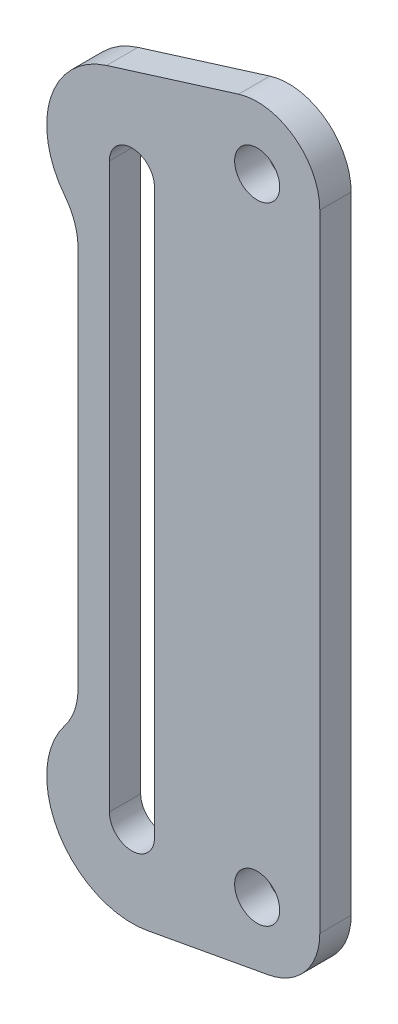
ISO-10303-21;
HEADER;
FILE_DESCRIPTION(('STEP AP214'),'2;1');
FILE_NAME('part.step','',(''),(''),'','','');
FILE_SCHEMA(('AUTOMOTIVE_DESIGN { 1 0 10303 214 1 1 1 1 }'));
ENDSEC;
DATA;
#1=APPLICATION_CONTEXT('core data for automotive mechanical design processes');
#2=APPLICATION_PROTOCOL_DEFINITION('international standard','automotive_design',2000,#1);
#3=PRODUCT_CONTEXT('',#1,'mechanical');
#4=PRODUCT('Part','Part','',(#3));
#5=PRODUCT_RELATED_PRODUCT_CATEGORY('part','',(#4));
#6=PRODUCT_DEFINITION_FORMATION('','',#4);
#7=PRODUCT_DEFINITION_CONTEXT('part definition',#1,'design');
#8=PRODUCT_DEFINITION('design','',#6,#7);
#9=PRODUCT_DEFINITION_SHAPE('','',#8);
#10=(LENGTH_UNIT() NAMED_UNIT(*) SI_UNIT(.MILLI.,.METRE.));
#11=(NAMED_UNIT(*) PLANE_ANGLE_UNIT() SI_UNIT($,.RADIAN.));
#12=(NAMED_UNIT(*) SI_UNIT($,.STERADIAN.) SOLID_ANGLE_UNIT());
#13=UNCERTAINTY_MEASURE_WITH_UNIT(LENGTH_MEASURE(1.E-05),#10,'distance_accuracy_value','');
#14=(GEOMETRIC_REPRESENTATION_CONTEXT(3) GLOBAL_UNCERTAINTY_ASSIGNED_CONTEXT((#13)) GLOBAL_UNIT_ASSIGNED_CONTEXT((#10,
#11,#12)) REPRESENTATION_CONTEXT('',''));
#15=CARTESIAN_POINT('',(0.,0.,0.));
#16=DIRECTION('',(0.,0.,1.));
#17=DIRECTION('',(1.,0.,0.));
#18=AXIS2_PLACEMENT_3D('',#15,#16,#17);
#19=CARTESIAN_POINT('',(-12.7,57.15,3.175));
#20=DIRECTION('',(0.,0.,1.));
#21=DIRECTION('',(1.,0.,0.));
#22=AXIS2_PLACEMENT_3D('',#19,#20,#21);
#23=PLANE('',#22);
#24=CARTESIAN_POINT('',(0.,0.,3.175));
#25=DIRECTION('',(0.,0.,1.));
#26=DIRECTION('',(1.,0.,0.));
#27=AXIS2_PLACEMENT_3D('',#24,#25,#26);
#28=CIRCLE('',#27,2.286);
#29=CARTESIAN_POINT('',(2.286,0.,3.175));
#30=VERTEX_POINT('',#29);
#31=EDGE_CURVE('E220',#30,#30,#28,.T.);
#32=ORIENTED_EDGE('',*,*,#31,.F.);
#33=EDGE_LOOP('',(#32));
#34=FACE_BOUND('',#33,.T.);
#35=CARTESIAN_POINT('',(-12.7,57.15,3.175));
#36=DIRECTION('',(0.,0.,1.));
#37=DIRECTION('',(1.,0.,0.));
#38=AXIS2_PLACEMENT_3D('',#35,#36,#37);
#39=CIRCLE('',#38,8.636);
#40=CARTESIAN_POINT('',(-15.2681707020678,65.3953014041356,3.175));
#41=VERTEX_POINT('',#40);
#42=CARTESIAN_POINT('',(-19.5063389830509,51.834527711689,3.175));
#43=VERTEX_POINT('',#42);
#44=EDGE_CURVE('E228',#41,#43,#39,.T.);
#45=ORIENTED_EDGE('',*,*,#44,.T.);
#46=CARTESIAN_POINT('',(-24.511,47.9260922055779,3.175));
#47=DIRECTION('',(0.,0.,1.));
#48=DIRECTION('',(1.,0.,0.));
#49=AXIS2_PLACEMENT_3D('',#46,#47,#48);
#50=CIRCLE('',#49,6.35);
#51=CARTESIAN_POINT('',(-18.161,47.9260922055779,3.175));
#52=VERTEX_POINT('',#51);
#53=EDGE_CURVE('E309',#43,#52,#50,.F.);
#54=ORIENTED_EDGE('',*,*,#53,.T.);
#55=DIRECTION('',(0.,-1.,0.));
#56=VECTOR('',#55,1.);
#57=CARTESIAN_POINT('',(-18.161,50.4598598669385,3.175));
#58=LINE('',#57,#56);
#59=CARTESIAN_POINT('',(-18.161,9.22390779442205,3.175));
#60=VERTEX_POINT('',#59);
#61=EDGE_CURVE('E232',#52,#60,#58,.T.);
#62=ORIENTED_EDGE('',*,*,#61,.T.);
#63=CARTESIAN_POINT('',(-24.511,9.22390779442205,3.175));
#64=DIRECTION('',(0.,0.,1.));
#65=DIRECTION('',(1.,0.,0.));
#66=AXIS2_PLACEMENT_3D('',#63,#64,#65);
#67=CIRCLE('',#66,6.35);
#68=CARTESIAN_POINT('',(-19.5063389830508,5.31547228831101,3.175));
#69=VERTEX_POINT('',#68);
#70=EDGE_CURVE('E11',#60,#69,#67,.F.);
#71=ORIENTED_EDGE('',*,*,#70,.T.);
#72=CARTESIAN_POINT('',(-12.7,0.,3.175));
#73=DIRECTION('',(0.,0.,1.));
#74=DIRECTION('',(1.,0.,0.));
#75=AXIS2_PLACEMENT_3D('',#72,#73,#74);
#76=CIRCLE('',#75,8.636);
#77=CARTESIAN_POINT('',(-11.14552,-8.49494484558905,3.175));
#78=VERTEX_POINT('',#77);
#79=EDGE_CURVE('E236',#69,#78,#76,.T.);
#80=ORIENTED_EDGE('',*,*,#79,.T.);
#81=DIRECTION('',(0.983666610188635,0.18,0.));
#82=VECTOR('',#81,1.);
#83=CARTESIAN_POINT('',(-11.14552,-8.49494484558905,3.175));
#84=LINE('',#83,#82);
#85=CARTESIAN_POINT('',(1.143,-6.24628297469783,3.175));
#86=VERTEX_POINT('',#85);
#87=EDGE_CURVE('E239',#78,#86,#84,.T.);
#88=ORIENTED_EDGE('',*,*,#87,.T.);
#89=CARTESIAN_POINT('',(0.,0.,3.175));
#90=DIRECTION('',(0.,0.,1.));
#91=DIRECTION('',(1.,0.,0.));
#92=AXIS2_PLACEMENT_3D('',#89,#90,#91);
#93=CIRCLE('',#92,6.35);
#94=CARTESIAN_POINT('',(6.35,0.,3.175));
#95=VERTEX_POINT('',#94);
#96=EDGE_CURVE('E242',#86,#95,#93,.T.);
#97=ORIENTED_EDGE('',*,*,#96,.T.);
#98=DIRECTION('',(0.,1.,0.));
#99=VECTOR('',#98,1.);
#100=CARTESIAN_POINT('',(6.34999999999999,63.5,3.175));
#101=LINE('',#100,#99);
#102=CARTESIAN_POINT('',(6.34999999999999,63.5,3.175));
#103=VERTEX_POINT('',#102);
#104=EDGE_CURVE('E245',#95,#103,#101,.T.);
#105=ORIENTED_EDGE('',*,*,#104,.T.);
#106=CARTESIAN_POINT('',(0.,63.5,3.175));
#107=DIRECTION('',(0.,0.,1.));
#108=DIRECTION('',(1.,0.,0.));
#109=AXIS2_PLACEMENT_3D('',#106,#107,#108);
#110=CIRCLE('',#109,6.35000000000001);
#111=CARTESIAN_POINT('',(-1.88836081034397,69.562721620688,3.175));
#112=VERTEX_POINT('',#111);
#113=EDGE_CURVE('E247',#103,#112,#110,.T.);
#114=ORIENTED_EDGE('',*,*,#113,.T.);
#115=DIRECTION('',(-0.954759310344558,-0.297379655172281,0.));
#116=VECTOR('',#115,1.);
#117=CARTESIAN_POINT('',(-15.2681707020678,65.3953014041356,3.175));
#118=LINE('',#117,#116);
#119=EDGE_CURVE('E249',#112,#41,#118,.T.);
#120=ORIENTED_EDGE('',*,*,#119,.T.);
#121=EDGE_LOOP('',(#45,#54,#62,#71,#80,#88,#97,#105,#114,#120));
#122=FACE_BOUND('',#121,.T.);
#123=CARTESIAN_POINT('',(0.,63.5,3.175));
#124=DIRECTION('',(0.,0.,1.));
#125=DIRECTION('',(1.,0.,0.));
#126=AXIS2_PLACEMENT_3D('',#123,#124,#125);
#127=CIRCLE('',#126,2.286);
#128=CARTESIAN_POINT('',(2.286,63.5,3.175));
#129=VERTEX_POINT('',#128);
#130=EDGE_CURVE('E214',#129,#129,#127,.T.);
#131=ORIENTED_EDGE('',*,*,#130,.F.);
#132=EDGE_LOOP('',(#131));
#133=FACE_BOUND('',#132,.T.);
#134=DIRECTION('',(0.,1.,0.));
#135=VECTOR('',#134,1.);
#136=CARTESIAN_POINT('',(-10.414,0.,3.175));
#137=LINE('',#136,#135);
#138=CARTESIAN_POINT('',(-10.414,0.,3.175));
#139=VERTEX_POINT('',#138);
#140=CARTESIAN_POINT('',(-10.414,57.15,3.175));
#141=VERTEX_POINT('',#140);
#142=EDGE_CURVE('E175',#139,#141,#137,.T.);
#143=ORIENTED_EDGE('',*,*,#142,.F.);
#144=CARTESIAN_POINT('',(-12.7,0.,3.175));
#145=DIRECTION('',(0.,0.,1.));
#146=DIRECTION('',(1.,0.,0.));
#147=AXIS2_PLACEMENT_3D('',#144,#145,#146);
#148=CIRCLE('',#147,2.286);
#149=CARTESIAN_POINT('',(-14.986,0.,3.175));
#150=VERTEX_POINT('',#149);
#151=EDGE_CURVE('E164',#150,#139,#148,.T.);
#152=ORIENTED_EDGE('',*,*,#151,.F.);
#153=DIRECTION('',(0.,-1.,0.));
#154=VECTOR('',#153,1.);
#155=CARTESIAN_POINT('',(-14.986,0.,3.175));
#156=LINE('',#155,#154);
#157=CARTESIAN_POINT('',(-14.986,57.15,3.175));
#158=VERTEX_POINT('',#157);
#159=EDGE_CURVE('E194',#158,#150,#156,.T.);
#160=ORIENTED_EDGE('',*,*,#159,.F.);
#161=CARTESIAN_POINT('',(-12.7,57.15,3.175));
#162=DIRECTION('',(0.,0.,1.));
#163=DIRECTION('',(1.,0.,0.));
#164=AXIS2_PLACEMENT_3D('',#161,#162,#163);
#165=CIRCLE('',#164,2.286);
#166=EDGE_CURVE('E189',#141,#158,#165,.T.);
#167=ORIENTED_EDGE('',*,*,#166,.F.);
#168=EDGE_LOOP('',(#143,#152,#160,#167));
#169=FACE_BOUND('',#168,.T.);
#170=ADVANCED_FACE('F45',(#34,#122,#133,#169),#23,.T.);
#171=CARTESIAN_POINT('',(-12.7,57.15,0.));
#172=DIRECTION('',(0.,0.,1.));
#173=DIRECTION('',(1.,0.,0.));
#174=AXIS2_PLACEMENT_3D('',#171,#172,#173);
#175=PLANE('',#174);
#176=CARTESIAN_POINT('',(0.,63.5,0.));
#177=DIRECTION('',(0.,0.,1.));
#178=DIRECTION('',(1.,0.,0.));
#179=AXIS2_PLACEMENT_3D('',#176,#177,#178);
#180=CIRCLE('',#179,2.286);
#181=CARTESIAN_POINT('',(2.286,63.5,0.));
#182=VERTEX_POINT('',#181);
#183=EDGE_CURVE('E184',#182,#182,#180,.T.);
#184=ORIENTED_EDGE('',*,*,#183,.T.);
#185=EDGE_LOOP('',(#184));
#186=FACE_BOUND('',#185,.T.);
#187=CARTESIAN_POINT('',(0.,0.,0.));
#188=DIRECTION('',(0.,0.,1.));
#189=DIRECTION('',(1.,0.,0.));
#190=AXIS2_PLACEMENT_3D('',#187,#188,#189);
#191=CIRCLE('',#190,2.286);
#192=CARTESIAN_POINT('',(2.286,0.,0.));
#193=VERTEX_POINT('',#192);
#194=EDGE_CURVE('E217',#193,#193,#191,.T.);
#195=ORIENTED_EDGE('',*,*,#194,.T.);
#196=EDGE_LOOP('',(#195));
#197=FACE_BOUND('',#196,.T.);
#198=CARTESIAN_POINT('',(-12.7,57.15,0.));
#199=DIRECTION('',(0.,0.,1.));
#200=DIRECTION('',(1.,0.,0.));
#201=AXIS2_PLACEMENT_3D('',#198,#199,#200);
#202=CIRCLE('',#201,8.636);
#203=CARTESIAN_POINT('',(-15.2681707020678,65.3953014041356,0.));
#204=VERTEX_POINT('',#203);
#205=CARTESIAN_POINT('',(-19.5063389830509,51.834527711689,0.));
#206=VERTEX_POINT('',#205);
#207=EDGE_CURVE('E224',#204,#206,#202,.T.);
#208=ORIENTED_EDGE('',*,*,#207,.F.);
#209=DIRECTION('',(-0.954759310344558,-0.297379655172281,0.));
#210=VECTOR('',#209,1.);
#211=CARTESIAN_POINT('',(-15.2681707020678,65.3953014041356,0.));
#212=LINE('',#211,#210);
#213=CARTESIAN_POINT('',(-1.88836081034397,69.562721620688,0.));
#214=VERTEX_POINT('',#213);
#215=EDGE_CURVE('E233',#214,#204,#212,.T.);
#216=ORIENTED_EDGE('',*,*,#215,.F.);
#217=CARTESIAN_POINT('',(0.,63.5,0.));
#218=DIRECTION('',(0.,0.,1.));
#219=DIRECTION('',(1.,0.,0.));
#220=AXIS2_PLACEMENT_3D('',#217,#218,#219);
#221=CIRCLE('',#220,6.35000000000001);
#222=CARTESIAN_POINT('',(6.34999999999999,63.5,0.));
#223=VERTEX_POINT('',#222);
#224=EDGE_CURVE('E270',#223,#214,#221,.T.);
#225=ORIENTED_EDGE('',*,*,#224,.F.);
#226=DIRECTION('',(0.,1.,0.));
#227=VECTOR('',#226,1.);
#228=CARTESIAN_POINT('',(6.34999999999999,63.5,0.));
#229=LINE('',#228,#227);
#230=CARTESIAN_POINT('',(6.35,0.,0.));
#231=VERTEX_POINT('',#230);
#232=EDGE_CURVE('E267',#231,#223,#229,.T.);
#233=ORIENTED_EDGE('',*,*,#232,.F.);
#234=CARTESIAN_POINT('',(0.,0.,0.));
#235=DIRECTION('',(0.,0.,1.));
#236=DIRECTION('',(1.,0.,0.));
#237=AXIS2_PLACEMENT_3D('',#234,#235,#236);
#238=CIRCLE('',#237,6.35);
#239=CARTESIAN_POINT('',(1.143,-6.24628297469783,0.));
#240=VERTEX_POINT('',#239);
#241=EDGE_CURVE('E264',#240,#231,#238,.T.);
#242=ORIENTED_EDGE('',*,*,#241,.F.);
#243=DIRECTION('',(0.983666610188635,0.18,0.));
#244=VECTOR('',#243,1.);
#245=CARTESIAN_POINT('',(-11.14552,-8.49494484558905,0.));
#246=LINE('',#245,#244);
#247=CARTESIAN_POINT('',(-11.14552,-8.49494484558905,0.));
#248=VERTEX_POINT('',#247);
#249=EDGE_CURVE('E261',#248,#240,#246,.T.);
#250=ORIENTED_EDGE('',*,*,#249,.F.);
#251=CARTESIAN_POINT('',(-12.7,0.,0.));
#252=DIRECTION('',(0.,0.,1.));
#253=DIRECTION('',(1.,0.,0.));
#254=AXIS2_PLACEMENT_3D('',#251,#252,#253);
#255=CIRCLE('',#254,8.636);
#256=CARTESIAN_POINT('',(-19.5063389830508,5.31547228831101,0.));
#257=VERTEX_POINT('',#256);
#258=EDGE_CURVE('E258',#257,#248,#255,.T.);
#259=ORIENTED_EDGE('',*,*,#258,.F.);
#260=CARTESIAN_POINT('',(-24.511,9.22390779442205,0.));
#261=DIRECTION('',(0.,0.,1.));
#262=DIRECTION('',(1.,0.,0.));
#263=AXIS2_PLACEMENT_3D('',#260,#261,#262);
#264=CIRCLE('',#263,6.35);
#265=CARTESIAN_POINT('',(-18.161,9.22390779442205,0.));
#266=VERTEX_POINT('',#265);
#267=EDGE_CURVE('E54',#257,#266,#264,.T.);
#268=ORIENTED_EDGE('',*,*,#267,.T.);
#269=DIRECTION('',(0.,-1.,0.));
#270=VECTOR('',#269,1.);
#271=CARTESIAN_POINT('',(-18.161,50.4598598669385,0.));
#272=LINE('',#271,#270);
#273=CARTESIAN_POINT('',(-18.161,47.9260922055779,0.));
#274=VERTEX_POINT('',#273);
#275=EDGE_CURVE('E254',#274,#266,#272,.T.);
#276=ORIENTED_EDGE('',*,*,#275,.F.);
#277=CARTESIAN_POINT('',(-24.511,47.9260922055779,0.));
#278=DIRECTION('',(0.,0.,1.));
#279=DIRECTION('',(1.,0.,0.));
#280=AXIS2_PLACEMENT_3D('',#277,#278,#279);
#281=CIRCLE('',#280,6.35);
#282=EDGE_CURVE('E306',#274,#206,#281,.T.);
#283=ORIENTED_EDGE('',*,*,#282,.T.);
#284=EDGE_LOOP('',(#208,#216,#225,#233,#242,#250,#259,#268,#276,#283));
#285=FACE_BOUND('',#284,.T.);
#286=CARTESIAN_POINT('',(-12.7,0.,0.));
#287=DIRECTION('',(0.,0.,1.));
#288=DIRECTION('',(1.,0.,0.));
#289=AXIS2_PLACEMENT_3D('',#286,#287,#288);
#290=CIRCLE('',#289,2.286);
#291=CARTESIAN_POINT('',(-14.986,0.,0.));
#292=VERTEX_POINT('',#291);
#293=CARTESIAN_POINT('',(-10.414,0.,0.));
#294=VERTEX_POINT('',#293);
#295=EDGE_CURVE('E199',#292,#294,#290,.T.);
#296=ORIENTED_EDGE('',*,*,#295,.T.);
#297=DIRECTION('',(0.,1.,0.));
#298=VECTOR('',#297,1.);
#299=CARTESIAN_POINT('',(-10.414,0.,0.));
#300=LINE('',#299,#298);
#301=CARTESIAN_POINT('',(-10.414,57.15,0.));
#302=VERTEX_POINT('',#301);
#303=EDGE_CURVE('E182',#294,#302,#300,.T.);
#304=ORIENTED_EDGE('',*,*,#303,.T.);
#305=CARTESIAN_POINT('',(-12.7,57.15,0.));
#306=DIRECTION('',(0.,0.,1.));
#307=DIRECTION('',(1.,0.,0.));
#308=AXIS2_PLACEMENT_3D('',#305,#306,#307);
#309=CIRCLE('',#308,2.286);
#310=CARTESIAN_POINT('',(-14.986,57.15,0.));
#311=VERTEX_POINT('',#310);
#312=EDGE_CURVE('E203',#302,#311,#309,.T.);
#313=ORIENTED_EDGE('',*,*,#312,.T.);
#314=DIRECTION('',(0.,-1.,0.));
#315=VECTOR('',#314,1.);
#316=CARTESIAN_POINT('',(-14.986,0.,0.));
#317=LINE('',#316,#315);
#318=EDGE_CURVE('E176',#311,#292,#317,.T.);
#319=ORIENTED_EDGE('',*,*,#318,.T.);
#320=EDGE_LOOP('',(#296,#304,#313,#319));
#321=FACE_BOUND('',#320,.T.);
#322=ADVANCED_FACE('F316',(#186,#197,#285,#321),#175,.F.);
#323=CARTESIAN_POINT('',(-12.7,57.15,3.175));
#324=DIRECTION('',(0.,0.,-1.));
#325=DIRECTION('',(-1.,0.,0.));
#326=AXIS2_PLACEMENT_3D('',#323,#324,#325);
#327=CYLINDRICAL_SURFACE('',#326,8.636);
#328=ORIENTED_EDGE('',*,*,#207,.T.);
#329=DIRECTION('',(0.,0.,-1.));
#330=VECTOR('',#329,1.);
#331=CARTESIAN_POINT('',(-19.5063389830509,51.834527711689,3.175));
#332=LINE('',#331,#330);
#333=EDGE_CURVE('E300',#206,#43,#332,.F.);
#334=ORIENTED_EDGE('',*,*,#333,.T.);
#335=ORIENTED_EDGE('',*,*,#44,.F.);
#336=DIRECTION('',(0.,0.,-1.));
#337=VECTOR('',#336,1.);
#338=CARTESIAN_POINT('',(-15.2681707020678,65.3953014041356,3.175));
#339=LINE('',#338,#337);
#340=EDGE_CURVE('E251',#41,#204,#339,.T.);
#341=ORIENTED_EDGE('',*,*,#340,.T.);
#342=EDGE_LOOP('',(#328,#334,#335,#341));
#343=FACE_BOUND('',#342,.T.);
#344=ADVANCED_FACE('F353',(#343),#327,.T.);
#345=CARTESIAN_POINT('',(-18.161,50.4598598669385,3.175));
#346=DIRECTION('',(1.,0.,0.));
#347=DIRECTION('',(0.,1.,0.));
#348=AXIS2_PLACEMENT_3D('',#345,#346,#347);
#349=PLANE('',#348);
#350=ORIENTED_EDGE('',*,*,#61,.F.);
#351=DIRECTION('',(0.,0.,1.));
#352=VECTOR('',#351,1.);
#353=CARTESIAN_POINT('',(-18.161,47.9260922055779,0.));
#354=LINE('',#353,#352);
#355=EDGE_CURVE('E296',#52,#274,#354,.F.);
#356=ORIENTED_EDGE('',*,*,#355,.T.);
#357=ORIENTED_EDGE('',*,*,#275,.T.);
#358=DIRECTION('',(0.,0.,1.));
#359=VECTOR('',#358,1.);
#360=CARTESIAN_POINT('',(-18.161,9.22390779442205,3.175));
#361=LINE('',#360,#359);
#362=EDGE_CURVE('E293',#266,#60,#361,.T.);
#363=ORIENTED_EDGE('',*,*,#362,.T.);
#364=EDGE_LOOP('',(#350,#356,#357,#363));
#365=FACE_BOUND('',#364,.T.);
#366=ADVANCED_FACE('F321',(#365),#349,.F.);
#367=CARTESIAN_POINT('',(-12.7,0.,3.175));
#368=DIRECTION('',(0.,0.,-1.));
#369=DIRECTION('',(-1.,0.,0.));
#370=AXIS2_PLACEMENT_3D('',#367,#368,#369);
#371=CYLINDRICAL_SURFACE('',#370,8.636);
#372=ORIENTED_EDGE('',*,*,#79,.F.);
#373=DIRECTION('',(0.,0.,-1.));
#374=VECTOR('',#373,1.);
#375=CARTESIAN_POINT('',(-19.5063389830508,5.31547228831101,3.175));
#376=LINE('',#375,#374);
#377=EDGE_CURVE('E303',#69,#257,#376,.T.);
#378=ORIENTED_EDGE('',*,*,#377,.T.);
#379=ORIENTED_EDGE('',*,*,#258,.T.);
#380=DIRECTION('',(0.,0.,-1.));
#381=VECTOR('',#380,1.);
#382=CARTESIAN_POINT('',(-11.14552,-8.49494484558905,3.175));
#383=LINE('',#382,#381);
#384=EDGE_CURVE('E289',#78,#248,#383,.T.);
#385=ORIENTED_EDGE('',*,*,#384,.F.);
#386=EDGE_LOOP('',(#372,#378,#379,#385));
#387=FACE_BOUND('',#386,.T.);
#388=ADVANCED_FACE('F324',(#387),#371,.T.);
#389=CARTESIAN_POINT('',(-11.14552,-8.49494484558905,3.175));
#390=DIRECTION('',(-0.18,0.983666610188635,0.));
#391=DIRECTION('',(-0.983666610188635,-0.18,0.));
#392=AXIS2_PLACEMENT_3D('',#389,#390,#391);
#393=PLANE('',#392);
#394=ORIENTED_EDGE('',*,*,#249,.T.);
#395=DIRECTION('',(0.,0.,-1.));
#396=VECTOR('',#395,1.);
#397=CARTESIAN_POINT('',(1.143,-6.24628297469783,3.175));
#398=LINE('',#397,#396);
#399=EDGE_CURVE('E285',#86,#240,#398,.T.);
#400=ORIENTED_EDGE('',*,*,#399,.F.);
#401=ORIENTED_EDGE('',*,*,#87,.F.);
#402=ORIENTED_EDGE('',*,*,#384,.T.);
#403=EDGE_LOOP('',(#394,#400,#401,#402));
#404=FACE_BOUND('',#403,.T.);
#405=ADVANCED_FACE('F332',(#404),#393,.F.);
#406=CARTESIAN_POINT('',(0.,0.,3.175));
#407=DIRECTION('',(0.,0.,-1.));
#408=DIRECTION('',(-1.,0.,0.));
#409=AXIS2_PLACEMENT_3D('',#406,#407,#408);
#410=CYLINDRICAL_SURFACE('',#409,6.35);
#411=ORIENTED_EDGE('',*,*,#241,.T.);
#412=DIRECTION('',(0.,0.,-1.));
#413=VECTOR('',#412,1.);
#414=CARTESIAN_POINT('',(6.35,0.,3.175));
#415=LINE('',#414,#413);
#416=EDGE_CURVE('E281',#95,#231,#415,.T.);
#417=ORIENTED_EDGE('',*,*,#416,.F.);
#418=ORIENTED_EDGE('',*,*,#96,.F.);
#419=ORIENTED_EDGE('',*,*,#399,.T.);
#420=EDGE_LOOP('',(#411,#417,#418,#419));
#421=FACE_BOUND('',#420,.T.);
#422=ADVANCED_FACE('F335',(#421),#410,.T.);
#423=CARTESIAN_POINT('',(6.34999999999999,63.5,3.175));
#424=DIRECTION('',(-1.,0.,0.));
#425=DIRECTION('',(0.,-1.,0.));
#426=AXIS2_PLACEMENT_3D('',#423,#424,#425);
#427=PLANE('',#426);
#428=ORIENTED_EDGE('',*,*,#232,.T.);
#429=DIRECTION('',(0.,0.,-1.));
#430=VECTOR('',#429,1.);
#431=CARTESIAN_POINT('',(6.34999999999999,63.5,3.175));
#432=LINE('',#431,#430);
#433=EDGE_CURVE('E278',#103,#223,#432,.T.);
#434=ORIENTED_EDGE('',*,*,#433,.F.);
#435=ORIENTED_EDGE('',*,*,#104,.F.);
#436=ORIENTED_EDGE('',*,*,#416,.T.);
#437=EDGE_LOOP('',(#428,#434,#435,#436));
#438=FACE_BOUND('',#437,.T.);
#439=ADVANCED_FACE('F340',(#438),#427,.F.);
#440=CARTESIAN_POINT('',(0.,63.5,3.175));
#441=DIRECTION('',(0.,0.,-1.));
#442=DIRECTION('',(-1.,0.,0.));
#443=AXIS2_PLACEMENT_3D('',#440,#441,#442);
#444=CYLINDRICAL_SURFACE('',#443,6.35000000000001);
#445=ORIENTED_EDGE('',*,*,#224,.T.);
#446=DIRECTION('',(0.,0.,-1.));
#447=VECTOR('',#446,1.);
#448=CARTESIAN_POINT('',(-1.88836081034397,69.562721620688,3.175));
#449=LINE('',#448,#447);
#450=EDGE_CURVE('E275',#112,#214,#449,.T.);
#451=ORIENTED_EDGE('',*,*,#450,.F.);
#452=ORIENTED_EDGE('',*,*,#113,.F.);
#453=ORIENTED_EDGE('',*,*,#433,.T.);
#454=EDGE_LOOP('',(#445,#451,#452,#453));
#455=FACE_BOUND('',#454,.T.);
#456=ADVANCED_FACE('F346',(#455),#444,.T.);
#457=CARTESIAN_POINT('',(-15.2681707020678,65.3953014041356,3.175));
#458=DIRECTION('',(0.297379655172281,-0.954759310344558,0.));
#459=DIRECTION('',(0.954759310344558,0.297379655172281,0.));
#460=AXIS2_PLACEMENT_3D('',#457,#458,#459);
#461=PLANE('',#460);
#462=ORIENTED_EDGE('',*,*,#215,.T.);
#463=ORIENTED_EDGE('',*,*,#340,.F.);
#464=ORIENTED_EDGE('',*,*,#119,.F.);
#465=ORIENTED_EDGE('',*,*,#450,.T.);
#466=EDGE_LOOP('',(#462,#463,#464,#465));
#467=FACE_BOUND('',#466,.T.);
#468=ADVANCED_FACE('F350',(#467),#461,.F.);
#469=CARTESIAN_POINT('',(0.,0.,3.175));
#470=DIRECTION('',(0.,0.,-1.));
#471=DIRECTION('',(-1.,0.,0.));
#472=AXIS2_PLACEMENT_3D('',#469,#470,#471);
#473=CYLINDRICAL_SURFACE('',#472,2.286);
#474=ORIENTED_EDGE('',*,*,#31,.T.);
#475=EDGE_LOOP('',(#474));
#476=FACE_BOUND('',#475,.T.);
#477=ORIENTED_EDGE('',*,*,#194,.F.);
#478=EDGE_LOOP('',(#477));
#479=FACE_BOUND('',#478,.T.);
#480=ADVANCED_FACE('F378',(#476,#479),#473,.F.);
#481=CARTESIAN_POINT('',(0.,63.5,3.175));
#482=DIRECTION('',(0.,0.,-1.));
#483=DIRECTION('',(-1.,0.,0.));
#484=AXIS2_PLACEMENT_3D('',#481,#482,#483);
#485=CYLINDRICAL_SURFACE('',#484,2.286);
#486=ORIENTED_EDGE('',*,*,#130,.T.);
#487=EDGE_LOOP('',(#486));
#488=FACE_BOUND('',#487,.T.);
#489=ORIENTED_EDGE('',*,*,#183,.F.);
#490=EDGE_LOOP('',(#489));
#491=FACE_BOUND('',#490,.T.);
#492=ADVANCED_FACE('F449',(#488,#491),#485,.F.);
#493=CARTESIAN_POINT('',(-12.7,0.,3.175));
#494=DIRECTION('',(0.,0.,-1.));
#495=DIRECTION('',(-1.,0.,0.));
#496=AXIS2_PLACEMENT_3D('',#493,#494,#495);
#497=CYLINDRICAL_SURFACE('',#496,2.286);
#498=ORIENTED_EDGE('',*,*,#295,.F.);
#499=DIRECTION('',(0.,0.,-1.));
#500=VECTOR('',#499,1.);
#501=CARTESIAN_POINT('',(-14.986,0.,3.175));
#502=LINE('',#501,#500);
#503=EDGE_CURVE('E170',#150,#292,#502,.T.);
#504=ORIENTED_EDGE('',*,*,#503,.F.);
#505=ORIENTED_EDGE('',*,*,#151,.T.);
#506=DIRECTION('',(0.,0.,-1.));
#507=VECTOR('',#506,1.);
#508=CARTESIAN_POINT('',(-10.414,0.,3.175));
#509=LINE('',#508,#507);
#510=EDGE_CURVE('E167',#139,#294,#509,.T.);
#511=ORIENTED_EDGE('',*,*,#510,.T.);
#512=EDGE_LOOP('',(#498,#504,#505,#511));
#513=FACE_BOUND('',#512,.T.);
#514=ADVANCED_FACE('F166',(#513),#497,.F.);
#515=CARTESIAN_POINT('',(-10.414,0.,3.175));
#516=DIRECTION('',(-1.,0.,0.));
#517=DIRECTION('',(0.,-1.,0.));
#518=AXIS2_PLACEMENT_3D('',#515,#516,#517);
#519=PLANE('',#518);
#520=ORIENTED_EDGE('',*,*,#303,.F.);
#521=ORIENTED_EDGE('',*,*,#510,.F.);
#522=ORIENTED_EDGE('',*,*,#142,.T.);
#523=DIRECTION('',(0.,0.,-1.));
#524=VECTOR('',#523,1.);
#525=CARTESIAN_POINT('',(-10.414,57.15,3.175));
#526=LINE('',#525,#524);
#527=EDGE_CURVE('E185',#141,#302,#526,.T.);
#528=ORIENTED_EDGE('',*,*,#527,.T.);
#529=EDGE_LOOP('',(#520,#521,#522,#528));
#530=FACE_BOUND('',#529,.T.);
#531=ADVANCED_FACE('F179',(#530),#519,.T.);
#532=CARTESIAN_POINT('',(-12.7,57.15,3.175));
#533=DIRECTION('',(0.,0.,-1.));
#534=DIRECTION('',(-1.,0.,0.));
#535=AXIS2_PLACEMENT_3D('',#532,#533,#534);
#536=CYLINDRICAL_SURFACE('',#535,2.286);
#537=ORIENTED_EDGE('',*,*,#312,.F.);
#538=ORIENTED_EDGE('',*,*,#527,.F.);
#539=ORIENTED_EDGE('',*,*,#166,.T.);
#540=DIRECTION('',(0.,0.,-1.));
#541=VECTOR('',#540,1.);
#542=CARTESIAN_POINT('',(-14.986,57.15,3.175));
#543=LINE('',#542,#541);
#544=EDGE_CURVE('E211',#158,#311,#543,.T.);
#545=ORIENTED_EDGE('',*,*,#544,.T.);
#546=EDGE_LOOP('',(#537,#538,#539,#545));
#547=FACE_BOUND('',#546,.T.);
#548=ADVANCED_FACE('F365',(#547),#536,.F.);
#549=CARTESIAN_POINT('',(-14.986,0.,3.175));
#550=DIRECTION('',(1.,0.,0.));
#551=DIRECTION('',(0.,1.,0.));
#552=AXIS2_PLACEMENT_3D('',#549,#550,#551);
#553=PLANE('',#552);
#554=ORIENTED_EDGE('',*,*,#318,.F.);
#555=ORIENTED_EDGE('',*,*,#544,.F.);
#556=ORIENTED_EDGE('',*,*,#159,.T.);
#557=ORIENTED_EDGE('',*,*,#503,.T.);
#558=EDGE_LOOP('',(#554,#555,#556,#557));
#559=FACE_BOUND('',#558,.T.);
#560=ADVANCED_FACE('F359',(#559),#553,.T.);
#561=CARTESIAN_POINT('',(-24.511,47.9260922055779,3.175));
#562=DIRECTION('',(0.,0.,-1.));
#563=DIRECTION('',(-1.,0.,0.));
#564=AXIS2_PLACEMENT_3D('',#561,#562,#563);
#565=CYLINDRICAL_SURFACE('',#564,6.35);
#566=ORIENTED_EDGE('',*,*,#53,.F.);
#567=ORIENTED_EDGE('',*,*,#333,.F.);
#568=ORIENTED_EDGE('',*,*,#282,.F.);
#569=ORIENTED_EDGE('',*,*,#355,.F.);
#570=EDGE_LOOP('',(#566,#567,#568,#569));
#571=FACE_BOUND('',#570,.T.);
#572=ADVANCED_FACE('F357',(#571),#565,.F.);
#573=CARTESIAN_POINT('',(-24.511,9.22390779442205,3.175));
#574=DIRECTION('',(0.,0.,-1.));
#575=DIRECTION('',(-1.,0.,0.));
#576=AXIS2_PLACEMENT_3D('',#573,#574,#575);
#577=CYLINDRICAL_SURFACE('',#576,6.35);
#578=ORIENTED_EDGE('',*,*,#70,.F.);
#579=ORIENTED_EDGE('',*,*,#362,.F.);
#580=ORIENTED_EDGE('',*,*,#267,.F.);
#581=ORIENTED_EDGE('',*,*,#377,.F.);
#582=EDGE_LOOP('',(#578,#579,#580,#581));
#583=FACE_BOUND('',#582,.T.);
#584=ADVANCED_FACE('F47',(#583),#577,.F.);
#585=CLOSED_SHELL('',(#170,#322,#344,#366,#388,#405,#422,#439,#456,#468,#480,#492,#514,#531,
#548,#560,#572,#584));
#586=MANIFOLD_SOLID_BREP('B2',#585);
#587=ADVANCED_BREP_SHAPE_REPRESENTATION('',(#18,#586),#14);
#588=SHAPE_DEFINITION_REPRESENTATION(#9,#587);
ENDSEC;
END-ISO-10303-21;
